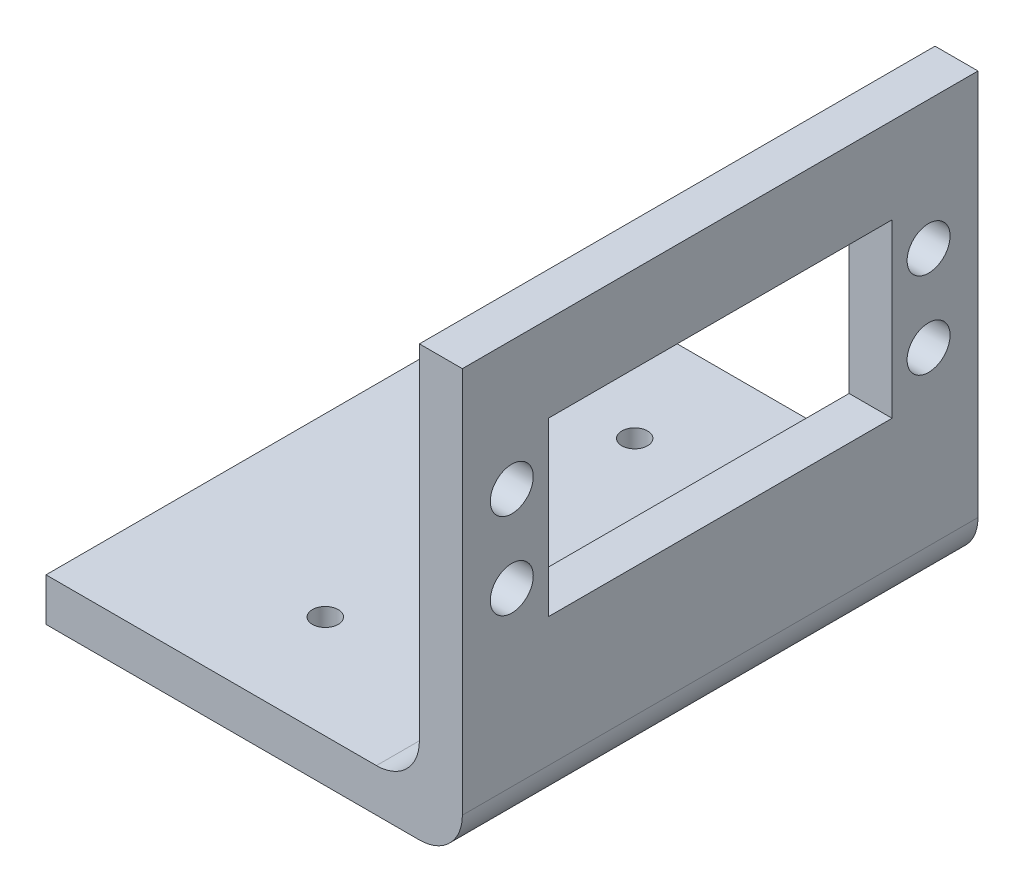
ISO-10303-21;
HEADER;
FILE_DESCRIPTION(('STEP AP214'),'2;1');
FILE_NAME('part.step','',(''),(''),'','','');
FILE_SCHEMA(('AUTOMOTIVE_DESIGN { 1 0 10303 214 1 1 1 1 }'));
ENDSEC;
DATA;
#1=APPLICATION_CONTEXT('core data for automotive mechanical design processes');
#2=APPLICATION_PROTOCOL_DEFINITION('international standard','automotive_design',2000,#1);
#3=PRODUCT_CONTEXT('',#1,'mechanical');
#4=PRODUCT('Part','Part','',(#3));
#5=PRODUCT_RELATED_PRODUCT_CATEGORY('part','',(#4));
#6=PRODUCT_DEFINITION_FORMATION('','',#4);
#7=PRODUCT_DEFINITION_CONTEXT('part definition',#1,'design');
#8=PRODUCT_DEFINITION('design','',#6,#7);
#9=PRODUCT_DEFINITION_SHAPE('','',#8);
#10=(LENGTH_UNIT() NAMED_UNIT(*) SI_UNIT(.MILLI.,.METRE.));
#11=(NAMED_UNIT(*) PLANE_ANGLE_UNIT() SI_UNIT($,.RADIAN.));
#12=(NAMED_UNIT(*) SI_UNIT($,.STERADIAN.) SOLID_ANGLE_UNIT());
#13=UNCERTAINTY_MEASURE_WITH_UNIT(LENGTH_MEASURE(1.E-05),#10,'distance_accuracy_value','');
#14=(GEOMETRIC_REPRESENTATION_CONTEXT(3) GLOBAL_UNCERTAINTY_ASSIGNED_CONTEXT((#13)) GLOBAL_UNIT_ASSIGNED_CONTEXT((#10,
#11,#12)) REPRESENTATION_CONTEXT('',''));
#15=CARTESIAN_POINT('',(0.,0.,0.));
#16=DIRECTION('',(0.,0.,1.));
#17=DIRECTION('',(1.,0.,0.));
#18=AXIS2_PLACEMENT_3D('',#15,#16,#17);
#19=CARTESIAN_POINT('',(-48.45,0.,-60.));
#20=DIRECTION('',(0.,-1.,0.));
#21=DIRECTION('',(0.,0.,-1.));
#22=AXIS2_PLACEMENT_3D('',#19,#20,#21);
#23=PLANE('',#22);
#24=DIRECTION('',(1.,0.,0.));
#25=VECTOR('',#24,1.);
#26=CARTESIAN_POINT('',(-48.45,0.,-60.));
#27=LINE('',#26,#25);
#28=CARTESIAN_POINT('',(-48.45,0.,-60.));
#29=VERTEX_POINT('',#28);
#30=CARTESIAN_POINT('',(-5.,0.,-60.));
#31=VERTEX_POINT('',#30);
#32=EDGE_CURVE('E314',#29,#31,#27,.T.);
#33=ORIENTED_EDGE('',*,*,#32,.T.);
#34=DIRECTION('',(0.,0.,1.));
#35=VECTOR('',#34,1.);
#36=CARTESIAN_POINT('',(-5.,0.,-60.));
#37=LINE('',#36,#35);
#38=CARTESIAN_POINT('',(-5.,0.,0.));
#39=VERTEX_POINT('',#38);
#40=EDGE_CURVE('E291',#31,#39,#37,.T.);
#41=ORIENTED_EDGE('',*,*,#40,.T.);
#42=DIRECTION('',(1.,0.,0.));
#43=VECTOR('',#42,1.);
#44=CARTESIAN_POINT('',(-48.45,0.,0.));
#45=LINE('',#44,#43);
#46=CARTESIAN_POINT('',(-48.45,0.,0.));
#47=VERTEX_POINT('',#46);
#48=EDGE_CURVE('E325',#47,#39,#45,.T.);
#49=ORIENTED_EDGE('',*,*,#48,.F.);
#50=DIRECTION('',(0.,0.,1.));
#51=VECTOR('',#50,1.);
#52=CARTESIAN_POINT('',(-48.45,0.,-60.));
#53=LINE('',#52,#51);
#54=EDGE_CURVE('E294',#29,#47,#53,.T.);
#55=ORIENTED_EDGE('',*,*,#54,.F.);
#56=EDGE_LOOP('',(#33,#41,#49,#55));
#57=FACE_BOUND('',#56,.T.);
#58=CARTESIAN_POINT('',(-27.95,0.,-48.));
#59=DIRECTION('',(0.,-1.,0.));
#60=DIRECTION('',(0.,0.,-1.));
#61=AXIS2_PLACEMENT_3D('',#58,#59,#60);
#62=CIRCLE('',#61,1.5);
#63=CARTESIAN_POINT('',(-27.95,0.,-49.5));
#64=VERTEX_POINT('',#63);
#65=EDGE_CURVE('E238',#64,#64,#62,.T.);
#66=ORIENTED_EDGE('',*,*,#65,.F.);
#67=EDGE_LOOP('',(#66));
#68=FACE_BOUND('',#67,.T.);
#69=CARTESIAN_POINT('',(-27.95,0.,-12.));
#70=DIRECTION('',(0.,-1.,0.));
#71=DIRECTION('',(0.,0.,-1.));
#72=AXIS2_PLACEMENT_3D('',#69,#70,#71);
#73=CIRCLE('',#72,1.5);
#74=CARTESIAN_POINT('',(-27.95,0.,-13.5));
#75=VERTEX_POINT('',#74);
#76=EDGE_CURVE('E237',#75,#75,#73,.T.);
#77=ORIENTED_EDGE('',*,*,#76,.F.);
#78=EDGE_LOOP('',(#77));
#79=FACE_BOUND('',#78,.T.);
#80=CARTESIAN_POINT('',(-27.95,0.,-30.));
#81=DIRECTION('',(0.,-1.,0.));
#82=DIRECTION('',(0.,0.,-1.));
#83=AXIS2_PLACEMENT_3D('',#80,#81,#82);
#84=CIRCLE('',#83,1.5);
#85=CARTESIAN_POINT('',(-27.95,0.,-31.5));
#86=VERTEX_POINT('',#85);
#87=EDGE_CURVE('E233',#86,#86,#84,.T.);
#88=ORIENTED_EDGE('',*,*,#87,.F.);
#89=EDGE_LOOP('',(#88));
#90=FACE_BOUND('',#89,.T.);
#91=ADVANCED_FACE('F41',(#57,#68,#79,#90),#23,.T.);
#92=CARTESIAN_POINT('',(-48.45,4.99999999999999,-60.));
#93=DIRECTION('',(-1.,0.,0.));
#94=DIRECTION('',(0.,0.,1.));
#95=AXIS2_PLACEMENT_3D('',#92,#93,#94);
#96=PLANE('',#95);
#97=DIRECTION('',(0.,-1.,0.));
#98=VECTOR('',#97,1.);
#99=CARTESIAN_POINT('',(-48.45,4.99999999999999,0.));
#100=LINE('',#99,#98);
#101=CARTESIAN_POINT('',(-48.45,4.99999999999999,0.));
#102=VERTEX_POINT('',#101);
#103=EDGE_CURVE('E311',#102,#47,#100,.T.);
#104=ORIENTED_EDGE('',*,*,#103,.F.);
#105=DIRECTION('',(0.,0.,1.));
#106=VECTOR('',#105,1.);
#107=CARTESIAN_POINT('',(-48.45,4.99999999999999,-60.));
#108=LINE('',#107,#106);
#109=CARTESIAN_POINT('',(-48.45,4.99999999999999,-60.));
#110=VERTEX_POINT('',#109);
#111=EDGE_CURVE('E307',#110,#102,#108,.T.);
#112=ORIENTED_EDGE('',*,*,#111,.F.);
#113=DIRECTION('',(0.,-1.,0.));
#114=VECTOR('',#113,1.);
#115=CARTESIAN_POINT('',(-48.45,4.99999999999999,-60.));
#116=LINE('',#115,#114);
#117=EDGE_CURVE('E305',#110,#29,#116,.T.);
#118=ORIENTED_EDGE('',*,*,#117,.T.);
#119=ORIENTED_EDGE('',*,*,#54,.T.);
#120=EDGE_LOOP('',(#104,#112,#118,#119));
#121=FACE_BOUND('',#120,.T.);
#122=ADVANCED_FACE('F365',(#121),#96,.T.);
#123=CARTESIAN_POINT('',(-4.99999999999999,5.,-60.));
#124=DIRECTION('',(0.,1.,0.));
#125=DIRECTION('',(-1.,0.,0.));
#126=AXIS2_PLACEMENT_3D('',#123,#124,#125);
#127=PLANE('',#126);
#128=DIRECTION('',(1.,0.,0.));
#129=VECTOR('',#128,1.);
#130=CARTESIAN_POINT('',(-4.99999999999999,5.,-35.));
#131=LINE('',#130,#129);
#132=CARTESIAN_POINT('',(-20.,5.,-35.));
#133=VERTEX_POINT('',#132);
#134=CARTESIAN_POINT('',(-9.99999999999999,5.,-35.));
#135=VERTEX_POINT('',#134);
#136=EDGE_CURVE('E166',#133,#135,#131,.T.);
#137=ORIENTED_EDGE('',*,*,#136,.T.);
#138=DIRECTION('',(0.,0.,1.));
#139=VECTOR('',#138,1.);
#140=CARTESIAN_POINT('',(-9.99999999999999,5.,-60.));
#141=LINE('',#140,#139);
#142=CARTESIAN_POINT('',(-9.99999999999999,5.,-60.));
#143=VERTEX_POINT('',#142);
#144=EDGE_CURVE('E257',#135,#143,#141,.F.);
#145=ORIENTED_EDGE('',*,*,#144,.T.);
#146=DIRECTION('',(-1.,0.,0.));
#147=VECTOR('',#146,1.);
#148=CARTESIAN_POINT('',(-4.99999999999999,5.,-60.));
#149=LINE('',#148,#147);
#150=EDGE_CURVE('E275',#143,#110,#149,.T.);
#151=ORIENTED_EDGE('',*,*,#150,.T.);
#152=ORIENTED_EDGE('',*,*,#111,.T.);
#153=DIRECTION('',(-1.,0.,0.));
#154=VECTOR('',#153,1.);
#155=CARTESIAN_POINT('',(-4.99999999999999,5.,0.));
#156=LINE('',#155,#154);
#157=CARTESIAN_POINT('',(-9.99999999999999,5.,0.));
#158=VERTEX_POINT('',#157);
#159=EDGE_CURVE('E315',#158,#102,#156,.T.);
#160=ORIENTED_EDGE('',*,*,#159,.F.);
#161=DIRECTION('',(0.,0.,1.));
#162=VECTOR('',#161,1.);
#163=CARTESIAN_POINT('',(-9.99999999999999,5.,-25.));
#164=LINE('',#163,#162);
#165=CARTESIAN_POINT('',(-9.99999999999999,5.,-25.));
#166=VERTEX_POINT('',#165);
#167=EDGE_CURVE('E56',#158,#166,#164,.F.);
#168=ORIENTED_EDGE('',*,*,#167,.T.);
#169=DIRECTION('',(1.,0.,0.));
#170=VECTOR('',#169,1.);
#171=CARTESIAN_POINT('',(-4.99999999999999,5.,-25.));
#172=LINE('',#171,#170);
#173=CARTESIAN_POINT('',(-20.,5.,-25.));
#174=VERTEX_POINT('',#173);
#175=EDGE_CURVE('E245',#174,#166,#172,.T.);
#176=ORIENTED_EDGE('',*,*,#175,.F.);
#177=DIRECTION('',(0.,0.,1.));
#178=VECTOR('',#177,1.);
#179=CARTESIAN_POINT('',(-20.,5.,-60.));
#180=LINE('',#179,#178);
#181=EDGE_CURVE('E241',#133,#174,#180,.T.);
#182=ORIENTED_EDGE('',*,*,#181,.F.);
#183=EDGE_LOOP('',(#137,#145,#151,#152,#160,#168,#176,#182));
#184=FACE_BOUND('',#183,.T.);
#185=CARTESIAN_POINT('',(-27.95,5.,-48.));
#186=DIRECTION('',(0.,1.,0.));
#187=DIRECTION('',(-1.,0.,0.));
#188=AXIS2_PLACEMENT_3D('',#185,#186,#187);
#189=CIRCLE('',#188,1.5);
#190=CARTESIAN_POINT('',(-29.45,5.,-48.));
#191=VERTEX_POINT('',#190);
#192=EDGE_CURVE('E225',#191,#191,#189,.T.);
#193=ORIENTED_EDGE('',*,*,#192,.F.);
#194=EDGE_LOOP('',(#193));
#195=FACE_BOUND('',#194,.T.);
#196=CARTESIAN_POINT('',(-27.95,5.,-12.));
#197=DIRECTION('',(0.,1.,0.));
#198=DIRECTION('',(-1.,0.,0.));
#199=AXIS2_PLACEMENT_3D('',#196,#197,#198);
#200=CIRCLE('',#199,1.5);
#201=CARTESIAN_POINT('',(-29.45,5.,-12.));
#202=VERTEX_POINT('',#201);
#203=EDGE_CURVE('E297',#202,#202,#200,.T.);
#204=ORIENTED_EDGE('',*,*,#203,.F.);
#205=EDGE_LOOP('',(#204));
#206=FACE_BOUND('',#205,.T.);
#207=CARTESIAN_POINT('',(-27.95,5.,-30.));
#208=DIRECTION('',(0.,1.,0.));
#209=DIRECTION('',(-1.,0.,0.));
#210=AXIS2_PLACEMENT_3D('',#207,#208,#209);
#211=CIRCLE('',#210,1.5);
#212=CARTESIAN_POINT('',(-29.45,5.,-30.));
#213=VERTEX_POINT('',#212);
#214=EDGE_CURVE('E236',#213,#213,#211,.T.);
#215=ORIENTED_EDGE('',*,*,#214,.F.);
#216=EDGE_LOOP('',(#215));
#217=FACE_BOUND('',#216,.T.);
#218=ADVANCED_FACE('F254',(#184,#195,#206,#217),#127,.T.);
#219=CARTESIAN_POINT('',(-5.,50.,-60.));
#220=DIRECTION('',(-1.,0.,0.));
#221=DIRECTION('',(0.,-1.,0.));
#222=AXIS2_PLACEMENT_3D('',#219,#220,#221);
#223=PLANE('',#222);
#224=DIRECTION('',(0.,-1.,0.));
#225=VECTOR('',#224,1.);
#226=CARTESIAN_POINT('',(-5.,50.,-60.));
#227=LINE('',#226,#225);
#228=CARTESIAN_POINT('',(-5.,50.,-60.));
#229=VERTEX_POINT('',#228);
#230=CARTESIAN_POINT('',(-4.99999999999999,10.,-60.));
#231=VERTEX_POINT('',#230);
#232=EDGE_CURVE('E272',#229,#231,#227,.T.);
#233=ORIENTED_EDGE('',*,*,#232,.T.);
#234=DIRECTION('',(0.,0.,1.));
#235=VECTOR('',#234,1.);
#236=CARTESIAN_POINT('',(-4.99999999999999,10.,-35.));
#237=LINE('',#236,#235);
#238=CARTESIAN_POINT('',(-4.99999999999999,10.,-35.));
#239=VERTEX_POINT('',#238);
#240=EDGE_CURVE('E164',#231,#239,#237,.T.);
#241=ORIENTED_EDGE('',*,*,#240,.T.);
#242=DIRECTION('',(0.,1.,0.));
#243=VECTOR('',#242,1.);
#244=CARTESIAN_POINT('',(-5.,50.,-35.));
#245=LINE('',#244,#243);
#246=CARTESIAN_POINT('',(-4.99999999999999,20.,-35.));
#247=VERTEX_POINT('',#246);
#248=EDGE_CURVE('E155',#239,#247,#245,.T.);
#249=ORIENTED_EDGE('',*,*,#248,.T.);
#250=DIRECTION('',(0.,0.,1.));
#251=VECTOR('',#250,1.);
#252=CARTESIAN_POINT('',(-5.,20.,-60.));
#253=LINE('',#252,#251);
#254=CARTESIAN_POINT('',(-5.,20.,-50.));
#255=VERTEX_POINT('',#254);
#256=EDGE_CURVE('E162',#255,#247,#253,.T.);
#257=ORIENTED_EDGE('',*,*,#256,.F.);
#258=DIRECTION('',(0.,-1.,0.));
#259=VECTOR('',#258,1.);
#260=CARTESIAN_POINT('',(-5.,50.,-50.));
#261=LINE('',#260,#259);
#262=CARTESIAN_POINT('',(-5.,40.,-50.));
#263=VERTEX_POINT('',#262);
#264=EDGE_CURVE('E188',#263,#255,#261,.T.);
#265=ORIENTED_EDGE('',*,*,#264,.F.);
#266=DIRECTION('',(0.,0.,-1.));
#267=VECTOR('',#266,1.);
#268=CARTESIAN_POINT('',(-5.,40.,-60.));
#269=LINE('',#268,#267);
#270=CARTESIAN_POINT('',(-5.,40.,-10.));
#271=VERTEX_POINT('',#270);
#272=EDGE_CURVE('E189',#271,#263,#269,.T.);
#273=ORIENTED_EDGE('',*,*,#272,.F.);
#274=DIRECTION('',(0.,1.,0.));
#275=VECTOR('',#274,1.);
#276=CARTESIAN_POINT('',(-5.,50.,-10.));
#277=LINE('',#276,#275);
#278=CARTESIAN_POINT('',(-5.,20.,-10.));
#279=VERTEX_POINT('',#278);
#280=EDGE_CURVE('E348',#279,#271,#277,.T.);
#281=ORIENTED_EDGE('',*,*,#280,.F.);
#282=CARTESIAN_POINT('',(-5.,20.,-25.));
#283=VERTEX_POINT('',#282);
#284=EDGE_CURVE('E180',#283,#279,#253,.T.);
#285=ORIENTED_EDGE('',*,*,#284,.F.);
#286=DIRECTION('',(0.,1.,0.));
#287=VECTOR('',#286,1.);
#288=CARTESIAN_POINT('',(-5.,50.,-25.));
#289=LINE('',#288,#287);
#290=CARTESIAN_POINT('',(-4.99999999999999,10.,-25.));
#291=VERTEX_POINT('',#290);
#292=EDGE_CURVE('E247',#291,#283,#289,.T.);
#293=ORIENTED_EDGE('',*,*,#292,.F.);
#294=DIRECTION('',(0.,0.,1.));
#295=VECTOR('',#294,1.);
#296=CARTESIAN_POINT('',(-4.99999999999999,10.,0.));
#297=LINE('',#296,#295);
#298=CARTESIAN_POINT('',(-4.99999999999999,10.,0.));
#299=VERTEX_POINT('',#298);
#300=EDGE_CURVE('E280',#291,#299,#297,.T.);
#301=ORIENTED_EDGE('',*,*,#300,.T.);
#302=DIRECTION('',(0.,-1.,0.));
#303=VECTOR('',#302,1.);
#304=CARTESIAN_POINT('',(-5.,50.,0.));
#305=LINE('',#304,#303);
#306=CARTESIAN_POINT('',(-5.,50.,0.));
#307=VERTEX_POINT('',#306);
#308=EDGE_CURVE('E317',#307,#299,#305,.T.);
#309=ORIENTED_EDGE('',*,*,#308,.F.);
#310=DIRECTION('',(0.,0.,1.));
#311=VECTOR('',#310,1.);
#312=CARTESIAN_POINT('',(-5.,50.,-60.));
#313=LINE('',#312,#311);
#314=EDGE_CURVE('E277',#229,#307,#313,.T.);
#315=ORIENTED_EDGE('',*,*,#314,.F.);
#316=EDGE_LOOP('',(#233,#241,#249,#257,#265,#273,#281,#285,#293,#301,#309,#315));
#317=FACE_BOUND('',#316,.T.);
#318=CARTESIAN_POINT('',(-5.,35.,-5.75));
#319=DIRECTION('',(-1.,0.,0.));
#320=DIRECTION('',(0.,-1.,0.));
#321=AXIS2_PLACEMENT_3D('',#318,#319,#320);
#322=CIRCLE('',#321,2.5);
#323=CARTESIAN_POINT('',(-5.,32.5,-5.75));
#324=VERTEX_POINT('',#323);
#325=EDGE_CURVE('E328',#324,#324,#322,.T.);
#326=ORIENTED_EDGE('',*,*,#325,.F.);
#327=EDGE_LOOP('',(#326));
#328=FACE_BOUND('',#327,.T.);
#329=CARTESIAN_POINT('',(-5.,25.,-5.75));
#330=DIRECTION('',(-1.,0.,0.));
#331=DIRECTION('',(0.,-1.,0.));
#332=AXIS2_PLACEMENT_3D('',#329,#330,#331);
#333=CIRCLE('',#332,2.5);
#334=CARTESIAN_POINT('',(-5.,22.5,-5.75));
#335=VERTEX_POINT('',#334);
#336=EDGE_CURVE('E339',#335,#335,#333,.T.);
#337=ORIENTED_EDGE('',*,*,#336,.F.);
#338=EDGE_LOOP('',(#337));
#339=FACE_BOUND('',#338,.T.);
#340=CARTESIAN_POINT('',(-5.,25.,-54.25));
#341=DIRECTION('',(-1.,0.,0.));
#342=DIRECTION('',(0.,-1.,0.));
#343=AXIS2_PLACEMENT_3D('',#340,#341,#342);
#344=CIRCLE('',#343,2.5);
#345=CARTESIAN_POINT('',(-5.,22.5,-54.25));
#346=VERTEX_POINT('',#345);
#347=EDGE_CURVE('E342',#346,#346,#344,.T.);
#348=ORIENTED_EDGE('',*,*,#347,.F.);
#349=EDGE_LOOP('',(#348));
#350=FACE_BOUND('',#349,.T.);
#351=CARTESIAN_POINT('',(-5.,35.,-54.25));
#352=DIRECTION('',(-1.,0.,0.));
#353=DIRECTION('',(0.,-1.,0.));
#354=AXIS2_PLACEMENT_3D('',#351,#352,#353);
#355=CIRCLE('',#354,2.5);
#356=CARTESIAN_POINT('',(-5.,32.5,-54.25));
#357=VERTEX_POINT('',#356);
#358=EDGE_CURVE('E345',#357,#357,#355,.T.);
#359=ORIENTED_EDGE('',*,*,#358,.F.);
#360=EDGE_LOOP('',(#359));
#361=FACE_BOUND('',#360,.T.);
#362=ADVANCED_FACE('F158',(#317,#328,#339,#350,#361),#223,.T.);
#363=CARTESIAN_POINT('',(0.,50.,-60.));
#364=DIRECTION('',(0.,1.,0.));
#365=DIRECTION('',(-1.,0.,0.));
#366=AXIS2_PLACEMENT_3D('',#363,#364,#365);
#367=PLANE('',#366);
#368=DIRECTION('',(-1.,0.,0.));
#369=VECTOR('',#368,1.);
#370=CARTESIAN_POINT('',(0.,50.,0.));
#371=LINE('',#370,#369);
#372=CARTESIAN_POINT('',(0.,50.,0.));
#373=VERTEX_POINT('',#372);
#374=EDGE_CURVE('E320',#373,#307,#371,.T.);
#375=ORIENTED_EDGE('',*,*,#374,.F.);
#376=DIRECTION('',(0.,0.,1.));
#377=VECTOR('',#376,1.);
#378=CARTESIAN_POINT('',(0.,50.,-60.));
#379=LINE('',#378,#377);
#380=CARTESIAN_POINT('',(0.,50.,-60.));
#381=VERTEX_POINT('',#380);
#382=EDGE_CURVE('E302',#381,#373,#379,.T.);
#383=ORIENTED_EDGE('',*,*,#382,.F.);
#384=DIRECTION('',(-1.,0.,0.));
#385=VECTOR('',#384,1.);
#386=CARTESIAN_POINT('',(0.,50.,-60.));
#387=LINE('',#386,#385);
#388=EDGE_CURVE('E278',#381,#229,#387,.T.);
#389=ORIENTED_EDGE('',*,*,#388,.T.);
#390=ORIENTED_EDGE('',*,*,#314,.T.);
#391=EDGE_LOOP('',(#375,#383,#389,#390));
#392=FACE_BOUND('',#391,.T.);
#393=ADVANCED_FACE('F380',(#392),#367,.T.);
#394=CARTESIAN_POINT('',(0.,0.,-60.));
#395=DIRECTION('',(1.,0.,0.));
#396=DIRECTION('',(0.,0.,-1.));
#397=AXIS2_PLACEMENT_3D('',#394,#395,#396);
#398=PLANE('',#397);
#399=DIRECTION('',(0.,1.,0.));
#400=VECTOR('',#399,1.);
#401=CARTESIAN_POINT('',(0.,0.,0.));
#402=LINE('',#401,#400);
#403=CARTESIAN_POINT('',(0.,5.,0.));
#404=VERTEX_POINT('',#403);
#405=EDGE_CURVE('E323',#404,#373,#402,.T.);
#406=ORIENTED_EDGE('',*,*,#405,.F.);
#407=DIRECTION('',(0.,0.,1.));
#408=VECTOR('',#407,1.);
#409=CARTESIAN_POINT('',(0.,5.,-60.));
#410=LINE('',#409,#408);
#411=CARTESIAN_POINT('',(0.,5.,-60.));
#412=VERTEX_POINT('',#411);
#413=EDGE_CURVE('E287',#404,#412,#410,.F.);
#414=ORIENTED_EDGE('',*,*,#413,.T.);
#415=DIRECTION('',(0.,1.,0.));
#416=VECTOR('',#415,1.);
#417=CARTESIAN_POINT('',(0.,0.,-60.));
#418=LINE('',#417,#416);
#419=EDGE_CURVE('E333',#412,#381,#418,.T.);
#420=ORIENTED_EDGE('',*,*,#419,.T.);
#421=ORIENTED_EDGE('',*,*,#382,.T.);
#422=EDGE_LOOP('',(#406,#414,#420,#421));
#423=FACE_BOUND('',#422,.T.);
#424=DIRECTION('',(0.,1.,0.));
#425=VECTOR('',#424,1.);
#426=CARTESIAN_POINT('',(0.,20.,-50.));
#427=LINE('',#426,#425);
#428=CARTESIAN_POINT('',(0.,20.,-50.));
#429=VERTEX_POINT('',#428);
#430=CARTESIAN_POINT('',(0.,40.,-50.));
#431=VERTEX_POINT('',#430);
#432=EDGE_CURVE('E207',#429,#431,#427,.T.);
#433=ORIENTED_EDGE('',*,*,#432,.F.);
#434=DIRECTION('',(0.,0.,-1.));
#435=VECTOR('',#434,1.);
#436=CARTESIAN_POINT('',(0.,20.,-50.));
#437=LINE('',#436,#435);
#438=CARTESIAN_POINT('',(0.,20.,-10.));
#439=VERTEX_POINT('',#438);
#440=EDGE_CURVE('E212',#439,#429,#437,.T.);
#441=ORIENTED_EDGE('',*,*,#440,.F.);
#442=DIRECTION('',(0.,-1.,0.));
#443=VECTOR('',#442,1.);
#444=CARTESIAN_POINT('',(0.,20.,-10.));
#445=LINE('',#444,#443);
#446=CARTESIAN_POINT('',(0.,40.,-10.));
#447=VERTEX_POINT('',#446);
#448=EDGE_CURVE('E216',#447,#439,#445,.T.);
#449=ORIENTED_EDGE('',*,*,#448,.F.);
#450=DIRECTION('',(0.,0.,1.));
#451=VECTOR('',#450,1.);
#452=CARTESIAN_POINT('',(0.,40.,-50.));
#453=LINE('',#452,#451);
#454=EDGE_CURVE('E202',#431,#447,#453,.T.);
#455=ORIENTED_EDGE('',*,*,#454,.F.);
#456=EDGE_LOOP('',(#433,#441,#449,#455));
#457=FACE_BOUND('',#456,.T.);
#458=CARTESIAN_POINT('',(0.,35.,-5.75));
#459=DIRECTION('',(1.,0.,0.));
#460=DIRECTION('',(0.,0.,1.));
#461=AXIS2_PLACEMENT_3D('',#458,#459,#460);
#462=CIRCLE('',#461,2.5);
#463=CARTESIAN_POINT('',(0.,35.,-3.25));
#464=VERTEX_POINT('',#463);
#465=EDGE_CURVE('E221',#464,#464,#462,.T.);
#466=ORIENTED_EDGE('',*,*,#465,.F.);
#467=EDGE_LOOP('',(#466));
#468=FACE_BOUND('',#467,.T.);
#469=CARTESIAN_POINT('',(0.,25.,-5.75));
#470=DIRECTION('',(1.,0.,0.));
#471=DIRECTION('',(0.,0.,-1.));
#472=AXIS2_PLACEMENT_3D('',#469,#470,#471);
#473=CIRCLE('',#472,2.5);
#474=CARTESIAN_POINT('',(0.,25.,-8.25));
#475=VERTEX_POINT('',#474);
#476=EDGE_CURVE('E224',#475,#475,#473,.T.);
#477=ORIENTED_EDGE('',*,*,#476,.F.);
#478=EDGE_LOOP('',(#477));
#479=FACE_BOUND('',#478,.T.);
#480=CARTESIAN_POINT('',(0.,25.,-54.25));
#481=DIRECTION('',(1.,0.,0.));
#482=DIRECTION('',(0.,0.,1.));
#483=AXIS2_PLACEMENT_3D('',#480,#481,#482);
#484=CIRCLE('',#483,2.5);
#485=CARTESIAN_POINT('',(0.,25.,-51.75));
#486=VERTEX_POINT('',#485);
#487=EDGE_CURVE('E228',#486,#486,#484,.T.);
#488=ORIENTED_EDGE('',*,*,#487,.F.);
#489=EDGE_LOOP('',(#488));
#490=FACE_BOUND('',#489,.T.);
#491=CARTESIAN_POINT('',(0.,35.,-54.25));
#492=DIRECTION('',(1.,0.,0.));
#493=DIRECTION('',(0.,0.,-1.));
#494=AXIS2_PLACEMENT_3D('',#491,#492,#493);
#495=CIRCLE('',#494,2.5);
#496=CARTESIAN_POINT('',(0.,35.,-56.75));
#497=VERTEX_POINT('',#496);
#498=EDGE_CURVE('E220',#497,#497,#495,.T.);
#499=ORIENTED_EDGE('',*,*,#498,.F.);
#500=EDGE_LOOP('',(#499));
#501=FACE_BOUND('',#500,.T.);
#502=ADVANCED_FACE('F355',(#423,#457,#468,#479,#490,#501),#398,.T.);
#503=CARTESIAN_POINT('',(0.,0.,-60.));
#504=DIRECTION('',(0.,0.,1.));
#505=DIRECTION('',(1.,0.,0.));
#506=AXIS2_PLACEMENT_3D('',#503,#504,#505);
#507=PLANE('',#506);
#508=ORIENTED_EDGE('',*,*,#419,.F.);
#509=CARTESIAN_POINT('',(-5.,5.,-60.));
#510=DIRECTION('',(0.,0.,1.));
#511=DIRECTION('',(1.,0.,0.));
#512=AXIS2_PLACEMENT_3D('',#509,#510,#511);
#513=CIRCLE('',#512,5.);
#514=EDGE_CURVE('E283',#412,#31,#513,.F.);
#515=ORIENTED_EDGE('',*,*,#514,.T.);
#516=ORIENTED_EDGE('',*,*,#32,.F.);
#517=ORIENTED_EDGE('',*,*,#117,.F.);
#518=ORIENTED_EDGE('',*,*,#150,.F.);
#519=CARTESIAN_POINT('',(-9.99999999999999,10.,-60.));
#520=DIRECTION('',(0.,0.,1.));
#521=DIRECTION('',(1.,0.,0.));
#522=AXIS2_PLACEMENT_3D('',#519,#520,#521);
#523=CIRCLE('',#522,5.);
#524=EDGE_CURVE('E49',#143,#231,#523,.T.);
#525=ORIENTED_EDGE('',*,*,#524,.T.);
#526=ORIENTED_EDGE('',*,*,#232,.F.);
#527=ORIENTED_EDGE('',*,*,#388,.F.);
#528=EDGE_LOOP('',(#508,#515,#516,#517,#518,#525,#526,#527));
#529=FACE_BOUND('',#528,.T.);
#530=ADVANCED_FACE('F270',(#529),#507,.F.);
#531=CARTESIAN_POINT('',(0.,0.,0.));
#532=DIRECTION('',(0.,0.,1.));
#533=DIRECTION('',(1.,0.,0.));
#534=AXIS2_PLACEMENT_3D('',#531,#532,#533);
#535=PLANE('',#534);
#536=ORIENTED_EDGE('',*,*,#48,.T.);
#537=CARTESIAN_POINT('',(-5.,5.,0.));
#538=DIRECTION('',(0.,0.,1.));
#539=DIRECTION('',(1.,0.,0.));
#540=AXIS2_PLACEMENT_3D('',#537,#538,#539);
#541=CIRCLE('',#540,5.);
#542=EDGE_CURVE('E289',#39,#404,#541,.T.);
#543=ORIENTED_EDGE('',*,*,#542,.T.);
#544=ORIENTED_EDGE('',*,*,#405,.T.);
#545=ORIENTED_EDGE('',*,*,#374,.T.);
#546=ORIENTED_EDGE('',*,*,#308,.T.);
#547=CARTESIAN_POINT('',(-9.99999999999999,10.,0.));
#548=DIRECTION('',(0.,0.,1.));
#549=DIRECTION('',(1.,0.,0.));
#550=AXIS2_PLACEMENT_3D('',#547,#548,#549);
#551=CIRCLE('',#550,5.);
#552=EDGE_CURVE('E11',#299,#158,#551,.F.);
#553=ORIENTED_EDGE('',*,*,#552,.T.);
#554=ORIENTED_EDGE('',*,*,#159,.T.);
#555=ORIENTED_EDGE('',*,*,#103,.T.);
#556=EDGE_LOOP('',(#536,#543,#544,#545,#546,#553,#554,#555));
#557=FACE_BOUND('',#556,.T.);
#558=ADVANCED_FACE('F361',(#557),#535,.T.);
#559=CARTESIAN_POINT('',(-10.,20.,-10.));
#560=DIRECTION('',(0.,0.,1.));
#561=DIRECTION('',(1.,0.,0.));
#562=AXIS2_PLACEMENT_3D('',#559,#560,#561);
#563=PLANE('',#562);
#564=ORIENTED_EDGE('',*,*,#280,.T.);
#565=DIRECTION('',(1.,0.,0.));
#566=VECTOR('',#565,1.);
#567=CARTESIAN_POINT('',(-10.,40.,-10.));
#568=LINE('',#567,#566);
#569=EDGE_CURVE('E192',#271,#447,#568,.T.);
#570=ORIENTED_EDGE('',*,*,#569,.T.);
#571=ORIENTED_EDGE('',*,*,#448,.T.);
#572=DIRECTION('',(1.,0.,0.));
#573=VECTOR('',#572,1.);
#574=CARTESIAN_POINT('',(-10.,20.,-10.));
#575=LINE('',#574,#573);
#576=EDGE_CURVE('E205',#279,#439,#575,.T.);
#577=ORIENTED_EDGE('',*,*,#576,.F.);
#578=EDGE_LOOP('',(#564,#570,#571,#577));
#579=FACE_BOUND('',#578,.T.);
#580=ADVANCED_FACE('F357',(#579),#563,.F.);
#581=CARTESIAN_POINT('',(-10.,40.,-50.));
#582=DIRECTION('',(0.,1.,0.));
#583=DIRECTION('',(0.,0.,1.));
#584=AXIS2_PLACEMENT_3D('',#581,#582,#583);
#585=PLANE('',#584);
#586=ORIENTED_EDGE('',*,*,#272,.T.);
#587=DIRECTION('',(1.,0.,0.));
#588=VECTOR('',#587,1.);
#589=CARTESIAN_POINT('',(-10.,40.,-50.));
#590=LINE('',#589,#588);
#591=EDGE_CURVE('E195',#263,#431,#590,.T.);
#592=ORIENTED_EDGE('',*,*,#591,.T.);
#593=ORIENTED_EDGE('',*,*,#454,.T.);
#594=ORIENTED_EDGE('',*,*,#569,.F.);
#595=EDGE_LOOP('',(#586,#592,#593,#594));
#596=FACE_BOUND('',#595,.T.);
#597=ADVANCED_FACE('F351',(#596),#585,.F.);
#598=CARTESIAN_POINT('',(-10.,20.,-50.));
#599=DIRECTION('',(0.,0.,-1.));
#600=DIRECTION('',(-1.,0.,0.));
#601=AXIS2_PLACEMENT_3D('',#598,#599,#600);
#602=PLANE('',#601);
#603=ORIENTED_EDGE('',*,*,#264,.T.);
#604=DIRECTION('',(1.,0.,0.));
#605=VECTOR('',#604,1.);
#606=CARTESIAN_POINT('',(-10.,20.,-50.));
#607=LINE('',#606,#605);
#608=EDGE_CURVE('E186',#255,#429,#607,.T.);
#609=ORIENTED_EDGE('',*,*,#608,.T.);
#610=ORIENTED_EDGE('',*,*,#432,.T.);
#611=ORIENTED_EDGE('',*,*,#591,.F.);
#612=EDGE_LOOP('',(#603,#609,#610,#611));
#613=FACE_BOUND('',#612,.T.);
#614=ADVANCED_FACE('F353',(#613),#602,.F.);
#615=CARTESIAN_POINT('',(-10.,20.,-50.));
#616=DIRECTION('',(0.,-1.,0.));
#617=DIRECTION('',(0.,0.,-1.));
#618=AXIS2_PLACEMENT_3D('',#615,#616,#617);
#619=PLANE('',#618);
#620=ORIENTED_EDGE('',*,*,#440,.T.);
#621=ORIENTED_EDGE('',*,*,#608,.F.);
#622=ORIENTED_EDGE('',*,*,#256,.T.);
#623=EDGE_CURVE('E173',#247,#283,#253,.T.);
#624=ORIENTED_EDGE('',*,*,#623,.T.);
#625=ORIENTED_EDGE('',*,*,#284,.T.);
#626=ORIENTED_EDGE('',*,*,#576,.T.);
#627=EDGE_LOOP('',(#620,#621,#622,#624,#625,#626));
#628=FACE_BOUND('',#627,.T.);
#629=ADVANCED_FACE('F184',(#628),#619,.F.);
#630=CARTESIAN_POINT('',(-10.,35.,-54.25));
#631=DIRECTION('',(1.,0.,0.));
#632=DIRECTION('',(0.,0.,-1.));
#633=AXIS2_PLACEMENT_3D('',#630,#631,#632);
#634=CYLINDRICAL_SURFACE('',#633,2.5);
#635=ORIENTED_EDGE('',*,*,#358,.T.);
#636=EDGE_LOOP('',(#635));
#637=FACE_BOUND('',#636,.T.);
#638=ORIENTED_EDGE('',*,*,#498,.T.);
#639=EDGE_LOOP('',(#638));
#640=FACE_BOUND('',#639,.T.);
#641=ADVANCED_FACE('F498',(#637,#640),#634,.F.);
#642=CARTESIAN_POINT('',(-10.,25.,-54.25));
#643=DIRECTION('',(1.,0.,0.));
#644=DIRECTION('',(0.,0.,-1.));
#645=AXIS2_PLACEMENT_3D('',#642,#643,#644);
#646=CYLINDRICAL_SURFACE('',#645,2.5);
#647=ORIENTED_EDGE('',*,*,#347,.T.);
#648=EDGE_LOOP('',(#647));
#649=FACE_BOUND('',#648,.T.);
#650=ORIENTED_EDGE('',*,*,#487,.T.);
#651=EDGE_LOOP('',(#650));
#652=FACE_BOUND('',#651,.T.);
#653=ADVANCED_FACE('F488',(#649,#652),#646,.F.);
#654=CARTESIAN_POINT('',(-10.,25.,-5.75));
#655=DIRECTION('',(1.,0.,0.));
#656=DIRECTION('',(0.,0.,-1.));
#657=AXIS2_PLACEMENT_3D('',#654,#655,#656);
#658=CYLINDRICAL_SURFACE('',#657,2.5);
#659=ORIENTED_EDGE('',*,*,#336,.T.);
#660=EDGE_LOOP('',(#659));
#661=FACE_BOUND('',#660,.T.);
#662=ORIENTED_EDGE('',*,*,#476,.T.);
#663=EDGE_LOOP('',(#662));
#664=FACE_BOUND('',#663,.T.);
#665=ADVANCED_FACE('F478',(#661,#664),#658,.F.);
#666=CARTESIAN_POINT('',(-10.,35.,-5.75));
#667=DIRECTION('',(1.,0.,0.));
#668=DIRECTION('',(0.,0.,-1.));
#669=AXIS2_PLACEMENT_3D('',#666,#667,#668);
#670=CYLINDRICAL_SURFACE('',#669,2.5);
#671=ORIENTED_EDGE('',*,*,#325,.T.);
#672=EDGE_LOOP('',(#671));
#673=FACE_BOUND('',#672,.T.);
#674=ORIENTED_EDGE('',*,*,#465,.T.);
#675=EDGE_LOOP('',(#674));
#676=FACE_BOUND('',#675,.T.);
#677=ADVANCED_FACE('F468',(#673,#676),#670,.F.);
#678=CARTESIAN_POINT('',(-27.95,10.,-30.));
#679=DIRECTION('',(0.,-1.,0.));
#680=DIRECTION('',(0.,0.,-1.));
#681=AXIS2_PLACEMENT_3D('',#678,#679,#680);
#682=CYLINDRICAL_SURFACE('',#681,1.5);
#683=ORIENTED_EDGE('',*,*,#214,.T.);
#684=EDGE_LOOP('',(#683));
#685=FACE_BOUND('',#684,.T.);
#686=ORIENTED_EDGE('',*,*,#87,.T.);
#687=EDGE_LOOP('',(#686));
#688=FACE_BOUND('',#687,.T.);
#689=ADVANCED_FACE('F458',(#685,#688),#682,.F.);
#690=CARTESIAN_POINT('',(-27.95,10.,-12.));
#691=DIRECTION('',(0.,-1.,0.));
#692=DIRECTION('',(0.,0.,-1.));
#693=AXIS2_PLACEMENT_3D('',#690,#691,#692);
#694=CYLINDRICAL_SURFACE('',#693,1.5);
#695=ORIENTED_EDGE('',*,*,#203,.T.);
#696=EDGE_LOOP('',(#695));
#697=FACE_BOUND('',#696,.T.);
#698=ORIENTED_EDGE('',*,*,#76,.T.);
#699=EDGE_LOOP('',(#698));
#700=FACE_BOUND('',#699,.T.);
#701=ADVANCED_FACE('F448',(#697,#700),#694,.F.);
#702=CARTESIAN_POINT('',(-27.95,10.,-48.));
#703=DIRECTION('',(0.,-1.,0.));
#704=DIRECTION('',(0.,0.,-1.));
#705=AXIS2_PLACEMENT_3D('',#702,#703,#704);
#706=CYLINDRICAL_SURFACE('',#705,1.5);
#707=ORIENTED_EDGE('',*,*,#192,.T.);
#708=EDGE_LOOP('',(#707));
#709=FACE_BOUND('',#708,.T.);
#710=ORIENTED_EDGE('',*,*,#65,.T.);
#711=EDGE_LOOP('',(#710));
#712=FACE_BOUND('',#711,.T.);
#713=ADVANCED_FACE('F438',(#709,#712),#706,.F.);
#714=CARTESIAN_POINT('',(-5.,20.,-30.));
#715=DIRECTION('',(-0.707106781186546,0.707106781186549,0.));
#716=DIRECTION('',(-0.707106781186549,-0.707106781186546,0.));
#717=AXIS2_PLACEMENT_3D('',#714,#715,#716);
#718=PLANE('',#717);
#719=DIRECTION('',(-0.707106781186549,-0.707106781186546,0.));
#720=VECTOR('',#719,1.);
#721=CARTESIAN_POINT('',(-5.,20.,-35.));
#722=LINE('',#721,#720);
#723=EDGE_CURVE('E175',#247,#133,#722,.T.);
#724=ORIENTED_EDGE('',*,*,#723,.T.);
#725=ORIENTED_EDGE('',*,*,#181,.T.);
#726=DIRECTION('',(-0.707106781186549,-0.707106781186546,0.));
#727=VECTOR('',#726,1.);
#728=CARTESIAN_POINT('',(-5.,20.,-25.));
#729=LINE('',#728,#727);
#730=EDGE_CURVE('E167',#283,#174,#729,.T.);
#731=ORIENTED_EDGE('',*,*,#730,.F.);
#732=ORIENTED_EDGE('',*,*,#623,.F.);
#733=EDGE_LOOP('',(#724,#725,#731,#732));
#734=FACE_BOUND('',#733,.T.);
#735=ADVANCED_FACE('F174',(#734),#718,.T.);
#736=CARTESIAN_POINT('',(-24.225,25.,-25.));
#737=DIRECTION('',(0.,0.,1.));
#738=DIRECTION('',(1.,0.,0.));
#739=AXIS2_PLACEMENT_3D('',#736,#737,#738);
#740=PLANE('',#739);
#741=ORIENTED_EDGE('',*,*,#175,.T.);
#742=CARTESIAN_POINT('',(-9.99999999999999,10.,-25.));
#743=DIRECTION('',(0.,0.,1.));
#744=DIRECTION('',(1.,0.,0.));
#745=AXIS2_PLACEMENT_3D('',#742,#743,#744);
#746=CIRCLE('',#745,5.);
#747=EDGE_CURVE('E262',#166,#291,#746,.T.);
#748=ORIENTED_EDGE('',*,*,#747,.T.);
#749=ORIENTED_EDGE('',*,*,#292,.T.);
#750=ORIENTED_EDGE('',*,*,#730,.T.);
#751=EDGE_LOOP('',(#741,#748,#749,#750));
#752=FACE_BOUND('',#751,.T.);
#753=ADVANCED_FACE('F251',(#752),#740,.T.);
#754=CARTESIAN_POINT('',(-24.225,25.,-35.));
#755=DIRECTION('',(0.,0.,1.));
#756=DIRECTION('',(1.,0.,0.));
#757=AXIS2_PLACEMENT_3D('',#754,#755,#756);
#758=PLANE('',#757);
#759=ORIENTED_EDGE('',*,*,#248,.F.);
#760=CARTESIAN_POINT('',(-9.99999999999999,10.,-35.));
#761=DIRECTION('',(0.,0.,1.));
#762=DIRECTION('',(1.,0.,0.));
#763=AXIS2_PLACEMENT_3D('',#760,#761,#762);
#764=CIRCLE('',#763,5.);
#765=EDGE_CURVE('E64',#239,#135,#764,.F.);
#766=ORIENTED_EDGE('',*,*,#765,.T.);
#767=ORIENTED_EDGE('',*,*,#136,.F.);
#768=ORIENTED_EDGE('',*,*,#723,.F.);
#769=EDGE_LOOP('',(#759,#766,#767,#768));
#770=FACE_BOUND('',#769,.T.);
#771=ADVANCED_FACE('F182',(#770),#758,.F.);
#772=CARTESIAN_POINT('',(-5.,5.,-60.));
#773=DIRECTION('',(0.,0.,1.));
#774=DIRECTION('',(1.,0.,0.));
#775=AXIS2_PLACEMENT_3D('',#772,#773,#774);
#776=CYLINDRICAL_SURFACE('',#775,5.);
#777=ORIENTED_EDGE('',*,*,#514,.F.);
#778=ORIENTED_EDGE('',*,*,#413,.F.);
#779=ORIENTED_EDGE('',*,*,#542,.F.);
#780=ORIENTED_EDGE('',*,*,#40,.F.);
#781=EDGE_LOOP('',(#777,#778,#779,#780));
#782=FACE_BOUND('',#781,.T.);
#783=ADVANCED_FACE('F374',(#782),#776,.T.);
#784=CARTESIAN_POINT('',(-9.99999999999999,10.,-60.));
#785=DIRECTION('',(0.,0.,-1.));
#786=DIRECTION('',(-1.,0.,0.));
#787=AXIS2_PLACEMENT_3D('',#784,#785,#786);
#788=CYLINDRICAL_SURFACE('',#787,5.);
#789=ORIENTED_EDGE('',*,*,#524,.F.);
#790=ORIENTED_EDGE('',*,*,#144,.F.);
#791=ORIENTED_EDGE('',*,*,#765,.F.);
#792=ORIENTED_EDGE('',*,*,#240,.F.);
#793=EDGE_LOOP('',(#789,#790,#791,#792));
#794=FACE_BOUND('',#793,.T.);
#795=ADVANCED_FACE('F261',(#794),#788,.F.);
#796=CARTESIAN_POINT('',(-9.99999999999999,10.,-60.));
#797=DIRECTION('',(0.,0.,-1.));
#798=DIRECTION('',(-1.,0.,0.));
#799=AXIS2_PLACEMENT_3D('',#796,#797,#798);
#800=CYLINDRICAL_SURFACE('',#799,5.);
#801=ORIENTED_EDGE('',*,*,#747,.F.);
#802=ORIENTED_EDGE('',*,*,#167,.F.);
#803=ORIENTED_EDGE('',*,*,#552,.F.);
#804=ORIENTED_EDGE('',*,*,#300,.F.);
#805=EDGE_LOOP('',(#801,#802,#803,#804));
#806=FACE_BOUND('',#805,.T.);
#807=ADVANCED_FACE('F43',(#806),#800,.F.);
#808=CLOSED_SHELL('',(#91,#122,#218,#362,#393,#502,#530,#558,#580,#597,#614,#629,#641,#653,#665,
#677,#689,#701,#713,#735,#753,#771,#783,#795,#807));
#809=MANIFOLD_SOLID_BREP('B2',#808);
#810=ADVANCED_BREP_SHAPE_REPRESENTATION('',(#18,#809),#14);
#811=SHAPE_DEFINITION_REPRESENTATION(#9,#810);
ENDSEC;
END-ISO-10303-21;
